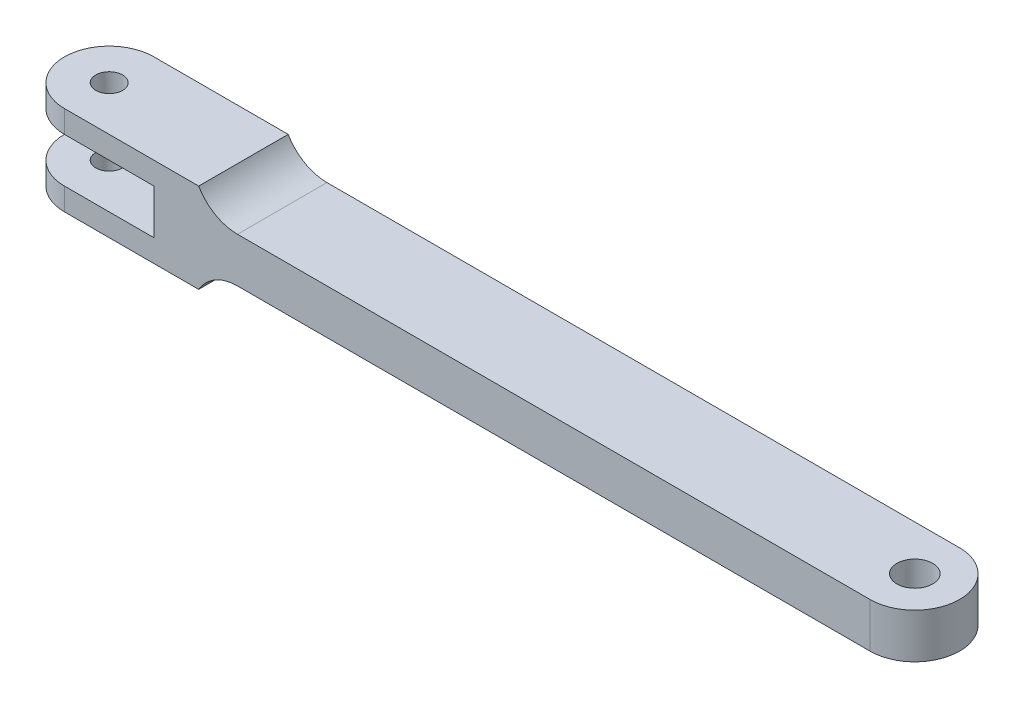
ISO-10303-21;
HEADER;
FILE_DESCRIPTION(('STEP AP214'),'2;1');
FILE_NAME('part.step','',(''),(''),'','','');
FILE_SCHEMA(('AUTOMOTIVE_DESIGN { 1 0 10303 214 1 1 1 1 }'));
ENDSEC;
DATA;
#1=APPLICATION_CONTEXT('core data for automotive mechanical design processes');
#2=APPLICATION_PROTOCOL_DEFINITION('international standard','automotive_design',2000,#1);
#3=PRODUCT_CONTEXT('',#1,'mechanical');
#4=PRODUCT('Part','Part','',(#3));
#5=PRODUCT_RELATED_PRODUCT_CATEGORY('part','',(#4));
#6=PRODUCT_DEFINITION_FORMATION('','',#4);
#7=PRODUCT_DEFINITION_CONTEXT('part definition',#1,'design');
#8=PRODUCT_DEFINITION('design','',#6,#7);
#9=PRODUCT_DEFINITION_SHAPE('','',#8);
#10=(LENGTH_UNIT() NAMED_UNIT(*) SI_UNIT(.MILLI.,.METRE.));
#11=(NAMED_UNIT(*) PLANE_ANGLE_UNIT() SI_UNIT($,.RADIAN.));
#12=(NAMED_UNIT(*) SI_UNIT($,.STERADIAN.) SOLID_ANGLE_UNIT());
#13=UNCERTAINTY_MEASURE_WITH_UNIT(LENGTH_MEASURE(1.E-05),#10,'distance_accuracy_value','');
#14=(GEOMETRIC_REPRESENTATION_CONTEXT(3) GLOBAL_UNCERTAINTY_ASSIGNED_CONTEXT((#13)) GLOBAL_UNIT_ASSIGNED_CONTEXT((#10,
#11,#12)) REPRESENTATION_CONTEXT('',''));
#15=CARTESIAN_POINT('',(0.,0.,0.));
#16=DIRECTION('',(0.,0.,1.));
#17=DIRECTION('',(1.,0.,0.));
#18=AXIS2_PLACEMENT_3D('',#15,#16,#17);
#19=CARTESIAN_POINT('',(0.,0.,10.));
#20=DIRECTION('',(0.,1.,0.));
#21=DIRECTION('',(0.,0.,1.));
#22=AXIS2_PLACEMENT_3D('',#19,#20,#21);
#23=PLANE('',#22);
#24=CARTESIAN_POINT('',(5.,0.,5.));
#25=DIRECTION('',(0.,1.,0.));
#26=DIRECTION('',(0.,0.,1.));
#27=AXIS2_PLACEMENT_3D('',#24,#25,#26);
#28=CIRCLE('',#27,1.5);
#29=CARTESIAN_POINT('',(5.,0.,6.5));
#30=VERTEX_POINT('',#29);
#31=EDGE_CURVE('E205',#30,#30,#28,.T.);
#32=ORIENTED_EDGE('',*,*,#31,.T.);
#33=EDGE_LOOP('',(#32));
#34=FACE_BOUND('',#33,.T.);
#35=DIRECTION('',(1.,0.,0.));
#36=VECTOR('',#35,1.);
#37=CARTESIAN_POINT('',(0.,0.,0.));
#38=LINE('',#37,#36);
#39=CARTESIAN_POINT('',(5.,0.,0.));
#40=VERTEX_POINT('',#39);
#41=CARTESIAN_POINT('',(20.,0.,0.));
#42=VERTEX_POINT('',#41);
#43=EDGE_CURVE('E127',#40,#42,#38,.T.);
#44=ORIENTED_EDGE('',*,*,#43,.T.);
#45=DIRECTION('',(0.,0.,1.));
#46=VECTOR('',#45,1.);
#47=CARTESIAN_POINT('',(20.,0.,10.));
#48=LINE('',#47,#46);
#49=CARTESIAN_POINT('',(20.,0.,10.));
#50=VERTEX_POINT('',#49);
#51=EDGE_CURVE('E122',#42,#50,#48,.T.);
#52=ORIENTED_EDGE('',*,*,#51,.T.);
#53=DIRECTION('',(1.,0.,0.));
#54=VECTOR('',#53,1.);
#55=CARTESIAN_POINT('',(0.,0.,10.));
#56=LINE('',#55,#54);
#57=CARTESIAN_POINT('',(5.,0.,10.));
#58=VERTEX_POINT('',#57);
#59=EDGE_CURVE('E125',#58,#50,#56,.T.);
#60=ORIENTED_EDGE('',*,*,#59,.F.);
#61=CARTESIAN_POINT('',(5.,0.,5.));
#62=DIRECTION('',(0.,-1.,0.));
#63=DIRECTION('',(0.,0.,1.));
#64=AXIS2_PLACEMENT_3D('',#61,#62,#63);
#65=CIRCLE('',#64,5.);
#66=EDGE_CURVE('E190',#58,#40,#65,.T.);
#67=ORIENTED_EDGE('',*,*,#66,.T.);
#68=EDGE_LOOP('',(#44,#52,#60,#67));
#69=FACE_BOUND('',#68,.T.);
#70=ADVANCED_FACE('F33',(#34,#69),#23,.F.);
#71=CARTESIAN_POINT('',(0.,10.,10.));
#72=DIRECTION('',(0.,-1.,0.));
#73=DIRECTION('',(0.,0.,-1.));
#74=AXIS2_PLACEMENT_3D('',#71,#72,#73);
#75=PLANE('',#74);
#76=CARTESIAN_POINT('',(5.,10.,5.));
#77=DIRECTION('',(0.,1.,0.));
#78=DIRECTION('',(0.,0.,1.));
#79=AXIS2_PLACEMENT_3D('',#76,#77,#78);
#80=CIRCLE('',#79,1.5);
#81=CARTESIAN_POINT('',(5.,10.,6.5));
#82=VERTEX_POINT('',#81);
#83=EDGE_CURVE('E204',#82,#82,#80,.T.);
#84=ORIENTED_EDGE('',*,*,#83,.F.);
#85=EDGE_LOOP('',(#84));
#86=FACE_BOUND('',#85,.T.);
#87=DIRECTION('',(-1.,0.,0.));
#88=VECTOR('',#87,1.);
#89=CARTESIAN_POINT('',(0.,10.,10.));
#90=LINE('',#89,#88);
#91=CARTESIAN_POINT('',(20.,10.,10.));
#92=VERTEX_POINT('',#91);
#93=CARTESIAN_POINT('',(5.,10.,10.));
#94=VERTEX_POINT('',#93);
#95=EDGE_CURVE('E141',#92,#94,#90,.T.);
#96=ORIENTED_EDGE('',*,*,#95,.F.);
#97=DIRECTION('',(0.,0.,-1.));
#98=VECTOR('',#97,1.);
#99=CARTESIAN_POINT('',(20.,10.,10.));
#100=LINE('',#99,#98);
#101=CARTESIAN_POINT('',(20.,10.,0.));
#102=VERTEX_POINT('',#101);
#103=EDGE_CURVE('E130',#92,#102,#100,.T.);
#104=ORIENTED_EDGE('',*,*,#103,.T.);
#105=DIRECTION('',(-1.,0.,0.));
#106=VECTOR('',#105,1.);
#107=CARTESIAN_POINT('',(0.,10.,0.));
#108=LINE('',#107,#106);
#109=CARTESIAN_POINT('',(5.,10.,0.));
#110=VERTEX_POINT('',#109);
#111=EDGE_CURVE('E223',#102,#110,#108,.T.);
#112=ORIENTED_EDGE('',*,*,#111,.T.);
#113=CARTESIAN_POINT('',(5.,10.,5.));
#114=DIRECTION('',(0.,-1.,0.));
#115=DIRECTION('',(0.,0.,1.));
#116=AXIS2_PLACEMENT_3D('',#113,#114,#115);
#117=CIRCLE('',#116,5.);
#118=EDGE_CURVE('E189',#94,#110,#117,.T.);
#119=ORIENTED_EDGE('',*,*,#118,.F.);
#120=EDGE_LOOP('',(#96,#104,#112,#119));
#121=FACE_BOUND('',#120,.T.);
#122=ADVANCED_FACE('F258',(#86,#121),#75,.F.);
#123=CARTESIAN_POINT('',(0.,7.50000000000001,10.));
#124=DIRECTION('',(0.,1.,0.));
#125=DIRECTION('',(0.,0.,1.));
#126=AXIS2_PLACEMENT_3D('',#123,#124,#125);
#127=PLANE('',#126);
#128=CARTESIAN_POINT('',(5.,7.50000000000001,5.));
#129=DIRECTION('',(0.,1.,0.));
#130=DIRECTION('',(0.,0.,1.));
#131=AXIS2_PLACEMENT_3D('',#128,#129,#130);
#132=CIRCLE('',#131,1.5);
#133=CARTESIAN_POINT('',(5.,7.50000000000001,6.5));
#134=VERTEX_POINT('',#133);
#135=EDGE_CURVE('E211',#134,#134,#132,.T.);
#136=ORIENTED_EDGE('',*,*,#135,.T.);
#137=EDGE_LOOP('',(#136));
#138=FACE_BOUND('',#137,.T.);
#139=DIRECTION('',(1.,0.,0.));
#140=VECTOR('',#139,1.);
#141=CARTESIAN_POINT('',(0.,7.50000000000001,10.));
#142=LINE('',#141,#140);
#143=CARTESIAN_POINT('',(5.,7.50000000000001,10.));
#144=VERTEX_POINT('',#143);
#145=CARTESIAN_POINT('',(15.,7.50000000000001,10.));
#146=VERTEX_POINT('',#145);
#147=EDGE_CURVE('E215',#144,#146,#142,.T.);
#148=ORIENTED_EDGE('',*,*,#147,.F.);
#149=CARTESIAN_POINT('',(5.,7.50000000000001,5.));
#150=DIRECTION('',(0.,1.,0.));
#151=DIRECTION('',(0.,0.,1.));
#152=AXIS2_PLACEMENT_3D('',#149,#150,#151);
#153=CIRCLE('',#152,5.);
#154=CARTESIAN_POINT('',(5.,7.50000000000001,0.));
#155=VERTEX_POINT('',#154);
#156=EDGE_CURVE('E201',#144,#155,#153,.F.);
#157=ORIENTED_EDGE('',*,*,#156,.T.);
#158=DIRECTION('',(1.,0.,0.));
#159=VECTOR('',#158,1.);
#160=CARTESIAN_POINT('',(0.,7.50000000000001,0.));
#161=LINE('',#160,#159);
#162=CARTESIAN_POINT('',(15.,7.50000000000001,0.));
#163=VERTEX_POINT('',#162);
#164=EDGE_CURVE('E225',#155,#163,#161,.T.);
#165=ORIENTED_EDGE('',*,*,#164,.T.);
#166=DIRECTION('',(0.,0.,-1.));
#167=VECTOR('',#166,1.);
#168=CARTESIAN_POINT('',(15.,7.50000000000001,10.));
#169=LINE('',#168,#167);
#170=EDGE_CURVE('E233',#146,#163,#169,.T.);
#171=ORIENTED_EDGE('',*,*,#170,.F.);
#172=EDGE_LOOP('',(#148,#157,#165,#171));
#173=FACE_BOUND('',#172,.T.);
#174=ADVANCED_FACE('F264',(#138,#173),#127,.F.);
#175=CARTESIAN_POINT('',(15.,7.50000000000001,10.));
#176=DIRECTION('',(1.,0.,0.));
#177=DIRECTION('',(0.,0.,-1.));
#178=AXIS2_PLACEMENT_3D('',#175,#176,#177);
#179=PLANE('',#178);
#180=DIRECTION('',(0.,-1.,0.));
#181=VECTOR('',#180,1.);
#182=CARTESIAN_POINT('',(15.,7.50000000000001,0.));
#183=LINE('',#182,#181);
#184=CARTESIAN_POINT('',(15.,2.50000000000001,0.));
#185=VERTEX_POINT('',#184);
#186=EDGE_CURVE('E227',#163,#185,#183,.T.);
#187=ORIENTED_EDGE('',*,*,#186,.T.);
#188=DIRECTION('',(0.,0.,-1.));
#189=VECTOR('',#188,1.);
#190=CARTESIAN_POINT('',(15.,2.50000000000001,10.));
#191=LINE('',#190,#189);
#192=CARTESIAN_POINT('',(15.,2.50000000000001,10.));
#193=VERTEX_POINT('',#192);
#194=EDGE_CURVE('E221',#193,#185,#191,.T.);
#195=ORIENTED_EDGE('',*,*,#194,.F.);
#196=DIRECTION('',(0.,-1.,0.));
#197=VECTOR('',#196,1.);
#198=CARTESIAN_POINT('',(15.,7.50000000000001,10.));
#199=LINE('',#198,#197);
#200=EDGE_CURVE('E217',#146,#193,#199,.T.);
#201=ORIENTED_EDGE('',*,*,#200,.F.);
#202=ORIENTED_EDGE('',*,*,#170,.T.);
#203=EDGE_LOOP('',(#187,#195,#201,#202));
#204=FACE_BOUND('',#203,.T.);
#205=ADVANCED_FACE('F305',(#204),#179,.F.);
#206=CARTESIAN_POINT('',(0.,2.50000000000001,10.));
#207=DIRECTION('',(0.,-1.,0.));
#208=DIRECTION('',(0.,0.,-1.));
#209=AXIS2_PLACEMENT_3D('',#206,#207,#208);
#210=PLANE('',#209);
#211=CARTESIAN_POINT('',(5.,2.50000000000001,5.));
#212=DIRECTION('',(0.,-1.,0.));
#213=DIRECTION('',(0.,0.,-1.));
#214=AXIS2_PLACEMENT_3D('',#211,#212,#213);
#215=CIRCLE('',#214,1.5);
#216=CARTESIAN_POINT('',(5.,2.50000000000001,3.5));
#217=VERTEX_POINT('',#216);
#218=EDGE_CURVE('E208',#217,#217,#215,.T.);
#219=ORIENTED_EDGE('',*,*,#218,.T.);
#220=EDGE_LOOP('',(#219));
#221=FACE_BOUND('',#220,.T.);
#222=DIRECTION('',(-1.,0.,0.));
#223=VECTOR('',#222,1.);
#224=CARTESIAN_POINT('',(0.,2.50000000000001,0.));
#225=LINE('',#224,#223);
#226=CARTESIAN_POINT('',(5.,2.50000000000001,0.));
#227=VERTEX_POINT('',#226);
#228=EDGE_CURVE('E142',#185,#227,#225,.T.);
#229=ORIENTED_EDGE('',*,*,#228,.T.);
#230=CARTESIAN_POINT('',(5.,2.50000000000001,5.));
#231=DIRECTION('',(0.,-1.,0.));
#232=DIRECTION('',(0.,0.,-1.));
#233=AXIS2_PLACEMENT_3D('',#230,#231,#232);
#234=CIRCLE('',#233,5.);
#235=CARTESIAN_POINT('',(5.,2.50000000000001,10.));
#236=VERTEX_POINT('',#235);
#237=EDGE_CURVE('E196',#227,#236,#234,.F.);
#238=ORIENTED_EDGE('',*,*,#237,.T.);
#239=DIRECTION('',(-1.,0.,0.));
#240=VECTOR('',#239,1.);
#241=CARTESIAN_POINT('',(0.,2.50000000000001,10.));
#242=LINE('',#241,#240);
#243=EDGE_CURVE('E219',#193,#236,#242,.T.);
#244=ORIENTED_EDGE('',*,*,#243,.F.);
#245=ORIENTED_EDGE('',*,*,#194,.T.);
#246=EDGE_LOOP('',(#229,#238,#244,#245));
#247=FACE_BOUND('',#246,.T.);
#248=ADVANCED_FACE('F238',(#221,#247),#210,.F.);
#249=CARTESIAN_POINT('',(0.,0.,10.));
#250=DIRECTION('',(0.,0.,-1.));
#251=DIRECTION('',(-1.,0.,0.));
#252=AXIS2_PLACEMENT_3D('',#249,#250,#251);
#253=PLANE('',#252);
#254=ORIENTED_EDGE('',*,*,#59,.T.);
#255=CARTESIAN_POINT('',(24.3301270189222,-2.5,10.));
#256=DIRECTION('',(0.,0.,-1.));
#257=DIRECTION('',(-1.,0.,0.));
#258=AXIS2_PLACEMENT_3D('',#255,#256,#257);
#259=CIRCLE('',#258,5.);
#260=CARTESIAN_POINT('',(24.3301270189222,2.5,10.));
#261=VERTEX_POINT('',#260);
#262=EDGE_CURVE('E136',#50,#261,#259,.T.);
#263=ORIENTED_EDGE('',*,*,#262,.T.);
#264=DIRECTION('',(-1.,0.,0.));
#265=VECTOR('',#264,1.);
#266=CARTESIAN_POINT('',(90.,2.5,10.));
#267=LINE('',#266,#265);
#268=CARTESIAN_POINT('',(95.,2.5,10.));
#269=VERTEX_POINT('',#268);
#270=EDGE_CURVE('E172',#269,#261,#267,.T.);
#271=ORIENTED_EDGE('',*,*,#270,.F.);
#272=DIRECTION('',(0.,1.,0.));
#273=VECTOR('',#272,1.);
#274=CARTESIAN_POINT('',(95.,2.5,10.));
#275=LINE('',#274,#273);
#276=CARTESIAN_POINT('',(95.,7.5,10.));
#277=VERTEX_POINT('',#276);
#278=EDGE_CURVE('E174',#269,#277,#275,.T.);
#279=ORIENTED_EDGE('',*,*,#278,.T.);
#280=DIRECTION('',(-1.,0.,0.));
#281=VECTOR('',#280,1.);
#282=CARTESIAN_POINT('',(90.,7.5,10.));
#283=LINE('',#282,#281);
#284=CARTESIAN_POINT('',(24.3301270189222,7.5,10.));
#285=VERTEX_POINT('',#284);
#286=EDGE_CURVE('E166',#277,#285,#283,.T.);
#287=ORIENTED_EDGE('',*,*,#286,.T.);
#288=CARTESIAN_POINT('',(24.3301270189222,12.5,10.));
#289=DIRECTION('',(0.,0.,-1.));
#290=DIRECTION('',(-1.,0.,0.));
#291=AXIS2_PLACEMENT_3D('',#288,#289,#290);
#292=CIRCLE('',#291,5.);
#293=EDGE_CURVE('E11',#285,#92,#292,.T.);
#294=ORIENTED_EDGE('',*,*,#293,.T.);
#295=ORIENTED_EDGE('',*,*,#95,.T.);
#296=DIRECTION('',(0.,1.,0.));
#297=VECTOR('',#296,1.);
#298=CARTESIAN_POINT('',(5.,0.,10.));
#299=LINE('',#298,#297);
#300=EDGE_CURVE('E197',#144,#94,#299,.T.);
#301=ORIENTED_EDGE('',*,*,#300,.F.);
#302=ORIENTED_EDGE('',*,*,#147,.T.);
#303=ORIENTED_EDGE('',*,*,#200,.T.);
#304=ORIENTED_EDGE('',*,*,#243,.T.);
#305=EDGE_CURVE('E140',#58,#236,#299,.T.);
#306=ORIENTED_EDGE('',*,*,#305,.F.);
#307=EDGE_LOOP('',(#254,#263,#271,#279,#287,#294,#295,#301,#302,#303,#304,#306));
#308=FACE_BOUND('',#307,.T.);
#309=ADVANCED_FACE('F134',(#308),#253,.F.);
#310=CARTESIAN_POINT('',(0.,0.,0.));
#311=DIRECTION('',(0.,0.,-1.));
#312=DIRECTION('',(-1.,0.,0.));
#313=AXIS2_PLACEMENT_3D('',#310,#311,#312);
#314=PLANE('',#313);
#315=DIRECTION('',(1.,0.,0.));
#316=VECTOR('',#315,1.);
#317=CARTESIAN_POINT('',(90.,2.5,0.));
#318=LINE('',#317,#316);
#319=CARTESIAN_POINT('',(24.3301270189222,2.5,0.));
#320=VERTEX_POINT('',#319);
#321=CARTESIAN_POINT('',(95.,2.5,0.));
#322=VERTEX_POINT('',#321);
#323=EDGE_CURVE('E163',#320,#322,#318,.T.);
#324=ORIENTED_EDGE('',*,*,#323,.F.);
#325=CARTESIAN_POINT('',(24.3301270189222,-2.5,0.));
#326=DIRECTION('',(0.,0.,-1.));
#327=DIRECTION('',(-1.,0.,0.));
#328=AXIS2_PLACEMENT_3D('',#325,#326,#327);
#329=CIRCLE('',#328,5.);
#330=EDGE_CURVE('E148',#320,#42,#329,.F.);
#331=ORIENTED_EDGE('',*,*,#330,.T.);
#332=ORIENTED_EDGE('',*,*,#43,.F.);
#333=DIRECTION('',(0.,1.,0.));
#334=VECTOR('',#333,1.);
#335=CARTESIAN_POINT('',(5.,0.,0.));
#336=LINE('',#335,#334);
#337=EDGE_CURVE('E192',#40,#227,#336,.T.);
#338=ORIENTED_EDGE('',*,*,#337,.T.);
#339=ORIENTED_EDGE('',*,*,#228,.F.);
#340=ORIENTED_EDGE('',*,*,#186,.F.);
#341=ORIENTED_EDGE('',*,*,#164,.F.);
#342=DIRECTION('',(0.,1.,0.));
#343=VECTOR('',#342,1.);
#344=CARTESIAN_POINT('',(5.,0.,0.));
#345=LINE('',#344,#343);
#346=EDGE_CURVE('E170',#110,#155,#345,.F.);
#347=ORIENTED_EDGE('',*,*,#346,.F.);
#348=ORIENTED_EDGE('',*,*,#111,.F.);
#349=CARTESIAN_POINT('',(24.3301270189222,12.5,0.));
#350=DIRECTION('',(0.,0.,-1.));
#351=DIRECTION('',(-1.,0.,0.));
#352=AXIS2_PLACEMENT_3D('',#349,#350,#351);
#353=CIRCLE('',#352,5.);
#354=CARTESIAN_POINT('',(24.3301270189222,7.5,0.));
#355=VERTEX_POINT('',#354);
#356=EDGE_CURVE('E41',#102,#355,#353,.F.);
#357=ORIENTED_EDGE('',*,*,#356,.T.);
#358=DIRECTION('',(1.,0.,0.));
#359=VECTOR('',#358,1.);
#360=CARTESIAN_POINT('',(90.,7.5,0.));
#361=LINE('',#360,#359);
#362=CARTESIAN_POINT('',(95.,7.5,0.));
#363=VERTEX_POINT('',#362);
#364=EDGE_CURVE('E153',#355,#363,#361,.T.);
#365=ORIENTED_EDGE('',*,*,#364,.T.);
#366=DIRECTION('',(0.,1.,0.));
#367=VECTOR('',#366,1.);
#368=CARTESIAN_POINT('',(95.,2.5,0.));
#369=LINE('',#368,#367);
#370=EDGE_CURVE('E187',#322,#363,#369,.T.);
#371=ORIENTED_EDGE('',*,*,#370,.F.);
#372=EDGE_LOOP('',(#324,#331,#332,#338,#339,#340,#341,#347,#348,#357,#365,#371));
#373=FACE_BOUND('',#372,.T.);
#374=ADVANCED_FACE('F244',(#373),#314,.T.);
#375=CARTESIAN_POINT('',(5.,0.,5.));
#376=DIRECTION('',(0.,1.,0.));
#377=DIRECTION('',(0.,0.,1.));
#378=AXIS2_PLACEMENT_3D('',#375,#376,#377);
#379=CYLINDRICAL_SURFACE('',#378,1.5);
#380=ORIENTED_EDGE('',*,*,#31,.F.);
#381=EDGE_LOOP('',(#380));
#382=FACE_BOUND('',#381,.T.);
#383=ORIENTED_EDGE('',*,*,#218,.F.);
#384=EDGE_LOOP('',(#383));
#385=FACE_BOUND('',#384,.T.);
#386=ADVANCED_FACE('F241',(#382,#385),#379,.F.);
#387=ORIENTED_EDGE('',*,*,#83,.T.);
#388=EDGE_LOOP('',(#387));
#389=FACE_BOUND('',#388,.T.);
#390=ORIENTED_EDGE('',*,*,#135,.F.);
#391=EDGE_LOOP('',(#390));
#392=FACE_BOUND('',#391,.T.);
#393=ADVANCED_FACE('F243',(#389,#392),#379,.F.);
#394=CARTESIAN_POINT('',(5.,0.,5.));
#395=DIRECTION('',(0.,1.,0.));
#396=DIRECTION('',(0.,0.,1.));
#397=AXIS2_PLACEMENT_3D('',#394,#395,#396);
#398=CYLINDRICAL_SURFACE('',#397,5.);
#399=ORIENTED_EDGE('',*,*,#237,.F.);
#400=ORIENTED_EDGE('',*,*,#337,.F.);
#401=ORIENTED_EDGE('',*,*,#66,.F.);
#402=ORIENTED_EDGE('',*,*,#305,.T.);
#403=EDGE_LOOP('',(#399,#400,#401,#402));
#404=FACE_BOUND('',#403,.T.);
#405=ADVANCED_FACE('F251',(#404),#398,.T.);
#406=ORIENTED_EDGE('',*,*,#118,.T.);
#407=ORIENTED_EDGE('',*,*,#346,.T.);
#408=ORIENTED_EDGE('',*,*,#156,.F.);
#409=ORIENTED_EDGE('',*,*,#300,.T.);
#410=EDGE_LOOP('',(#406,#407,#408,#409));
#411=FACE_BOUND('',#410,.T.);
#412=ADVANCED_FACE('F289',(#411),#398,.T.);
#413=CARTESIAN_POINT('',(95.,2.5,5.));
#414=DIRECTION('',(0.,-1.,0.));
#415=DIRECTION('',(0.,0.,-1.));
#416=AXIS2_PLACEMENT_3D('',#413,#414,#415);
#417=PLANE('',#416);
#418=ORIENTED_EDGE('',*,*,#270,.T.);
#419=DIRECTION('',(0.,0.,1.));
#420=VECTOR('',#419,1.);
#421=CARTESIAN_POINT('',(24.3301270189222,2.5,0.));
#422=LINE('',#421,#420);
#423=EDGE_CURVE('E147',#261,#320,#422,.F.);
#424=ORIENTED_EDGE('',*,*,#423,.T.);
#425=ORIENTED_EDGE('',*,*,#323,.T.);
#426=CARTESIAN_POINT('',(95.,2.5,5.));
#427=DIRECTION('',(0.,-1.,0.));
#428=DIRECTION('',(0.,0.,-1.));
#429=AXIS2_PLACEMENT_3D('',#426,#427,#428);
#430=CIRCLE('',#429,5.);
#431=EDGE_CURVE('E165',#322,#269,#430,.T.);
#432=ORIENTED_EDGE('',*,*,#431,.T.);
#433=EDGE_LOOP('',(#418,#424,#425,#432));
#434=FACE_BOUND('',#433,.T.);
#435=CARTESIAN_POINT('',(95.,2.5,5.));
#436=DIRECTION('',(0.,-1.,0.));
#437=DIRECTION('',(0.,0.,-1.));
#438=AXIS2_PLACEMENT_3D('',#435,#436,#437);
#439=CIRCLE('',#438,2.);
#440=CARTESIAN_POINT('',(95.,2.5,3.));
#441=VERTEX_POINT('',#440);
#442=EDGE_CURVE('E157',#441,#441,#439,.T.);
#443=ORIENTED_EDGE('',*,*,#442,.F.);
#444=EDGE_LOOP('',(#443));
#445=FACE_BOUND('',#444,.T.);
#446=ADVANCED_FACE('F286',(#434,#445),#417,.T.);
#447=CARTESIAN_POINT('',(95.,7.5,5.));
#448=DIRECTION('',(0.,-1.,0.));
#449=DIRECTION('',(0.,0.,-1.));
#450=AXIS2_PLACEMENT_3D('',#447,#448,#449);
#451=PLANE('',#450);
#452=ORIENTED_EDGE('',*,*,#364,.F.);
#453=DIRECTION('',(0.,0.,1.));
#454=VECTOR('',#453,1.);
#455=CARTESIAN_POINT('',(24.3301270189222,7.5,5.));
#456=LINE('',#455,#454);
#457=EDGE_CURVE('E48',#355,#285,#456,.T.);
#458=ORIENTED_EDGE('',*,*,#457,.T.);
#459=ORIENTED_EDGE('',*,*,#286,.F.);
#460=CARTESIAN_POINT('',(95.,7.5,5.));
#461=DIRECTION('',(0.,-1.,0.));
#462=DIRECTION('',(0.,0.,-1.));
#463=AXIS2_PLACEMENT_3D('',#460,#461,#462);
#464=CIRCLE('',#463,5.);
#465=EDGE_CURVE('E156',#363,#277,#464,.T.);
#466=ORIENTED_EDGE('',*,*,#465,.F.);
#467=EDGE_LOOP('',(#452,#458,#459,#466));
#468=FACE_BOUND('',#467,.T.);
#469=CARTESIAN_POINT('',(95.,7.5,5.));
#470=DIRECTION('',(0.,-1.,0.));
#471=DIRECTION('',(0.,0.,-1.));
#472=AXIS2_PLACEMENT_3D('',#469,#470,#471);
#473=CIRCLE('',#472,2.);
#474=CARTESIAN_POINT('',(95.,7.5,3.));
#475=VERTEX_POINT('',#474);
#476=EDGE_CURVE('E318',#475,#475,#473,.T.);
#477=ORIENTED_EDGE('',*,*,#476,.T.);
#478=EDGE_LOOP('',(#477));
#479=FACE_BOUND('',#478,.T.);
#480=ADVANCED_FACE('F281',(#468,#479),#451,.F.);
#481=CARTESIAN_POINT('',(95.,2.5,5.));
#482=DIRECTION('',(0.,1.,0.));
#483=DIRECTION('',(0.,0.,1.));
#484=AXIS2_PLACEMENT_3D('',#481,#482,#483);
#485=CYLINDRICAL_SURFACE('',#484,5.);
#486=ORIENTED_EDGE('',*,*,#465,.T.);
#487=ORIENTED_EDGE('',*,*,#278,.F.);
#488=ORIENTED_EDGE('',*,*,#431,.F.);
#489=ORIENTED_EDGE('',*,*,#370,.T.);
#490=EDGE_LOOP('',(#486,#487,#488,#489));
#491=FACE_BOUND('',#490,.T.);
#492=ADVANCED_FACE('F275',(#491),#485,.T.);
#493=CARTESIAN_POINT('',(95.,2.5,5.));
#494=DIRECTION('',(0.,1.,0.));
#495=DIRECTION('',(0.,0.,1.));
#496=AXIS2_PLACEMENT_3D('',#493,#494,#495);
#497=CYLINDRICAL_SURFACE('',#496,2.);
#498=ORIENTED_EDGE('',*,*,#442,.T.);
#499=EDGE_LOOP('',(#498));
#500=FACE_BOUND('',#499,.T.);
#501=ORIENTED_EDGE('',*,*,#476,.F.);
#502=EDGE_LOOP('',(#501));
#503=FACE_BOUND('',#502,.T.);
#504=ADVANCED_FACE('F269',(#500,#503),#497,.F.);
#505=CARTESIAN_POINT('',(24.3301270189222,-2.5,10.));
#506=DIRECTION('',(0.,0.,-1.));
#507=DIRECTION('',(-1.,0.,0.));
#508=AXIS2_PLACEMENT_3D('',#505,#506,#507);
#509=CYLINDRICAL_SURFACE('',#508,5.);
#510=ORIENTED_EDGE('',*,*,#262,.F.);
#511=ORIENTED_EDGE('',*,*,#51,.F.);
#512=ORIENTED_EDGE('',*,*,#330,.F.);
#513=ORIENTED_EDGE('',*,*,#423,.F.);
#514=EDGE_LOOP('',(#510,#511,#512,#513));
#515=FACE_BOUND('',#514,.T.);
#516=ADVANCED_FACE('F145',(#515),#509,.F.);
#517=CARTESIAN_POINT('',(24.3301270189222,12.5,10.));
#518=DIRECTION('',(0.,0.,1.));
#519=DIRECTION('',(1.,0.,0.));
#520=AXIS2_PLACEMENT_3D('',#517,#518,#519);
#521=CYLINDRICAL_SURFACE('',#520,5.);
#522=ORIENTED_EDGE('',*,*,#293,.F.);
#523=ORIENTED_EDGE('',*,*,#457,.F.);
#524=ORIENTED_EDGE('',*,*,#356,.F.);
#525=ORIENTED_EDGE('',*,*,#103,.F.);
#526=EDGE_LOOP('',(#522,#523,#524,#525));
#527=FACE_BOUND('',#526,.T.);
#528=ADVANCED_FACE('F35',(#527),#521,.F.);
#529=CLOSED_SHELL('',(#70,#122,#174,#205,#248,#309,#374,#386,#393,#405,#412,#446,#480,#492,#504,
#516,#528));
#530=MANIFOLD_SOLID_BREP('B2',#529);
#531=ADVANCED_BREP_SHAPE_REPRESENTATION('',(#18,#530),#14);
#532=SHAPE_DEFINITION_REPRESENTATION(#9,#531);
ENDSEC;
END-ISO-10303-21;
